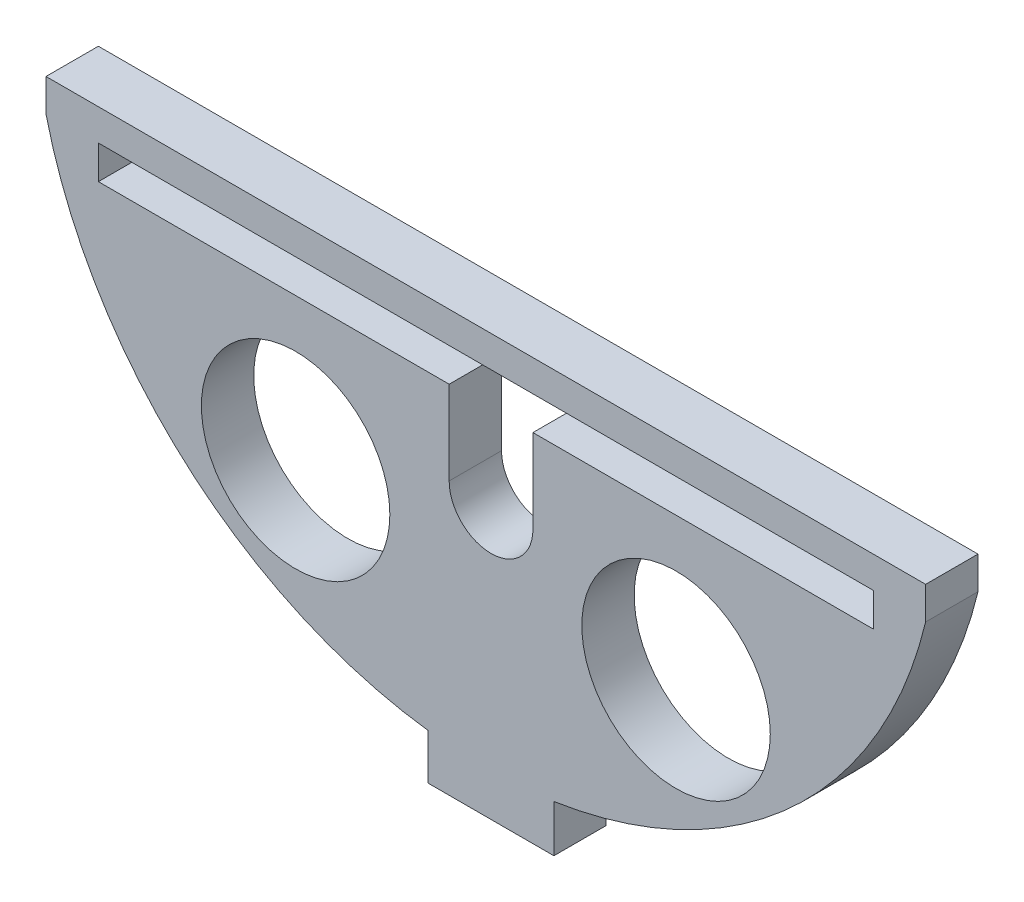
ISO-10303-21;
HEADER;
FILE_DESCRIPTION(('STEP AP214'),'2;1');
FILE_NAME('part.step','',(''),(''),'','','');
FILE_SCHEMA(('AUTOMOTIVE_DESIGN { 1 0 10303 214 1 1 1 1 }'));
ENDSEC;
DATA;
#1=APPLICATION_CONTEXT('core data for automotive mechanical design processes');
#2=APPLICATION_PROTOCOL_DEFINITION('international standard','automotive_design',2000,#1);
#3=PRODUCT_CONTEXT('',#1,'mechanical');
#4=PRODUCT('Part','Part','',(#3));
#5=PRODUCT_RELATED_PRODUCT_CATEGORY('part','',(#4));
#6=PRODUCT_DEFINITION_FORMATION('','',#4);
#7=PRODUCT_DEFINITION_CONTEXT('part definition',#1,'design');
#8=PRODUCT_DEFINITION('design','',#6,#7);
#9=PRODUCT_DEFINITION_SHAPE('','',#8);
#10=(LENGTH_UNIT() NAMED_UNIT(*) SI_UNIT(.MILLI.,.METRE.));
#11=(NAMED_UNIT(*) PLANE_ANGLE_UNIT() SI_UNIT($,.RADIAN.));
#12=(NAMED_UNIT(*) SI_UNIT($,.STERADIAN.) SOLID_ANGLE_UNIT());
#13=UNCERTAINTY_MEASURE_WITH_UNIT(LENGTH_MEASURE(1.E-05),#10,'distance_accuracy_value','');
#14=(GEOMETRIC_REPRESENTATION_CONTEXT(3) GLOBAL_UNCERTAINTY_ASSIGNED_CONTEXT((#13)) GLOBAL_UNIT_ASSIGNED_CONTEXT((#10,
#11,#12)) REPRESENTATION_CONTEXT('',''));
#15=CARTESIAN_POINT('',(0.,0.,0.));
#16=DIRECTION('',(0.,0.,1.));
#17=DIRECTION('',(1.,0.,0.));
#18=AXIS2_PLACEMENT_3D('',#15,#16,#17);
#19=CARTESIAN_POINT('',(-42.,0.,5.));
#20=DIRECTION('',(1.,0.,0.));
#21=DIRECTION('',(0.,0.,-1.));
#22=AXIS2_PLACEMENT_3D('',#19,#20,#21);
#23=PLANE('',#22);
#24=DIRECTION('',(0.,-1.,0.));
#25=VECTOR('',#24,1.);
#26=CARTESIAN_POINT('',(-42.,0.,0.));
#27=LINE('',#26,#25);
#28=CARTESIAN_POINT('',(-42.,4.6,0.));
#29=VERTEX_POINT('',#28);
#30=CARTESIAN_POINT('',(-42.,1.48862027218817,0.));
#31=VERTEX_POINT('',#30);
#32=EDGE_CURVE('E187',#29,#31,#27,.T.);
#33=ORIENTED_EDGE('',*,*,#32,.T.);
#34=DIRECTION('',(0.,0.,-1.));
#35=VECTOR('',#34,1.);
#36=CARTESIAN_POINT('',(-42.,1.48862027218817,5.));
#37=LINE('',#36,#35);
#38=CARTESIAN_POINT('',(-42.,1.48862027218817,5.));
#39=VERTEX_POINT('',#38);
#40=EDGE_CURVE('E11',#39,#31,#37,.T.);
#41=ORIENTED_EDGE('',*,*,#40,.F.);
#42=DIRECTION('',(0.,-1.,0.));
#43=VECTOR('',#42,1.);
#44=CARTESIAN_POINT('',(-42.,0.,5.));
#45=LINE('',#44,#43);
#46=CARTESIAN_POINT('',(-42.,4.6,5.));
#47=VERTEX_POINT('',#46);
#48=EDGE_CURVE('E262',#47,#39,#45,.T.);
#49=ORIENTED_EDGE('',*,*,#48,.F.);
#50=DIRECTION('',(0.,0.,-1.));
#51=VECTOR('',#50,1.);
#52=CARTESIAN_POINT('',(-42.,4.6,5.));
#53=LINE('',#52,#51);
#54=EDGE_CURVE('E53',#47,#29,#53,.T.);
#55=ORIENTED_EDGE('',*,*,#54,.T.);
#56=EDGE_LOOP('',(#33,#41,#49,#55));
#57=FACE_BOUND('',#56,.T.);
#58=ADVANCED_FACE('F34',(#57),#23,.F.);
#59=CARTESIAN_POINT('',(0.,11.6,5.));
#60=DIRECTION('',(0.,0.,-1.));
#61=DIRECTION('',(-1.,0.,0.));
#62=AXIS2_PLACEMENT_3D('',#59,#60,#61);
#63=CYLINDRICAL_SURFACE('',#62,43.2);
#64=CARTESIAN_POINT('',(0.,11.6,0.));
#65=DIRECTION('',(0.,0.,1.));
#66=DIRECTION('',(1.,0.,0.));
#67=AXIS2_PLACEMENT_3D('',#64,#65,#66);
#68=CIRCLE('',#67,43.2);
#69=CARTESIAN_POINT('',(-5.49999999999997,-31.2484538810912,0.));
#70=VERTEX_POINT('',#69);
#71=EDGE_CURVE('E189',#31,#70,#68,.T.);
#72=ORIENTED_EDGE('',*,*,#71,.T.);
#73=DIRECTION('',(0.,0.,-1.));
#74=VECTOR('',#73,1.);
#75=CARTESIAN_POINT('',(-5.49999999999997,-31.2484538810912,90.8848065725249));
#76=LINE('',#75,#74);
#77=CARTESIAN_POINT('',(-5.49999999999997,-31.2484538810912,5.));
#78=VERTEX_POINT('',#77);
#79=EDGE_CURVE('E284',#78,#70,#76,.T.);
#80=ORIENTED_EDGE('',*,*,#79,.F.);
#81=CARTESIAN_POINT('',(0.,11.6,5.));
#82=DIRECTION('',(0.,0.,1.));
#83=DIRECTION('',(1.,0.,0.));
#84=AXIS2_PLACEMENT_3D('',#81,#82,#83);
#85=CIRCLE('',#84,43.2);
#86=EDGE_CURVE('E149',#39,#78,#85,.T.);
#87=ORIENTED_EDGE('',*,*,#86,.F.);
#88=ORIENTED_EDGE('',*,*,#40,.T.);
#89=EDGE_LOOP('',(#72,#80,#87,#88));
#90=FACE_BOUND('',#89,.T.);
#91=ADVANCED_FACE('F290',(#90),#63,.T.);
#92=CARTESIAN_POINT('',(6.50000000000004,-31.1081959347383,0.));
#93=VERTEX_POINT('',#92);
#94=CARTESIAN_POINT('',(42.,1.48862027218852,0.));
#95=VERTEX_POINT('',#94);
#96=EDGE_CURVE('E154',#93,#95,#68,.T.);
#97=ORIENTED_EDGE('',*,*,#96,.T.);
#98=DIRECTION('',(0.,0.,-1.));
#99=VECTOR('',#98,1.);
#100=CARTESIAN_POINT('',(42.,1.48862027218852,5.));
#101=LINE('',#100,#99);
#102=CARTESIAN_POINT('',(42.,1.48862027218852,5.));
#103=VERTEX_POINT('',#102);
#104=EDGE_CURVE('E44',#103,#95,#101,.T.);
#105=ORIENTED_EDGE('',*,*,#104,.F.);
#106=CARTESIAN_POINT('',(6.50000000000004,-31.1081959347383,5.));
#107=VERTEX_POINT('',#106);
#108=EDGE_CURVE('E135',#107,#103,#85,.T.);
#109=ORIENTED_EDGE('',*,*,#108,.F.);
#110=DIRECTION('',(0.,0.,-1.));
#111=VECTOR('',#110,1.);
#112=CARTESIAN_POINT('',(6.50000000000004,-31.1081959347383,90.8848065725249));
#113=LINE('',#112,#111);
#114=EDGE_CURVE('E292',#107,#93,#113,.T.);
#115=ORIENTED_EDGE('',*,*,#114,.T.);
#116=EDGE_LOOP('',(#97,#105,#109,#115));
#117=FACE_BOUND('',#116,.T.);
#118=ADVANCED_FACE('F152',(#117),#63,.T.);
#119=CARTESIAN_POINT('',(42.,0.,5.));
#120=DIRECTION('',(1.,0.,0.));
#121=DIRECTION('',(0.,0.,-1.));
#122=AXIS2_PLACEMENT_3D('',#119,#120,#121);
#123=PLANE('',#122);
#124=DIRECTION('',(0.,-1.,0.));
#125=VECTOR('',#124,1.);
#126=CARTESIAN_POINT('',(42.,0.,0.));
#127=LINE('',#126,#125);
#128=CARTESIAN_POINT('',(42.,4.6,0.));
#129=VERTEX_POINT('',#128);
#130=EDGE_CURVE('E192',#129,#95,#127,.T.);
#131=ORIENTED_EDGE('',*,*,#130,.F.);
#132=DIRECTION('',(0.,0.,-1.));
#133=VECTOR('',#132,1.);
#134=CARTESIAN_POINT('',(42.,4.6,5.));
#135=LINE('',#134,#133);
#136=CARTESIAN_POINT('',(42.,4.6,5.));
#137=VERTEX_POINT('',#136);
#138=EDGE_CURVE('E92',#137,#129,#135,.T.);
#139=ORIENTED_EDGE('',*,*,#138,.F.);
#140=DIRECTION('',(0.,-1.,0.));
#141=VECTOR('',#140,1.);
#142=CARTESIAN_POINT('',(42.,0.,5.));
#143=LINE('',#142,#141);
#144=EDGE_CURVE('E141',#137,#103,#143,.T.);
#145=ORIENTED_EDGE('',*,*,#144,.T.);
#146=ORIENTED_EDGE('',*,*,#104,.T.);
#147=EDGE_LOOP('',(#131,#139,#145,#146));
#148=FACE_BOUND('',#147,.T.);
#149=ADVANCED_FACE('F158',(#148),#123,.T.);
#150=CARTESIAN_POINT('',(0.500000000000032,-9.59999999999999,5.));
#151=DIRECTION('',(0.,0.,-1.));
#152=DIRECTION('',(-1.,0.,0.));
#153=AXIS2_PLACEMENT_3D('',#150,#151,#152);
#154=CYLINDRICAL_SURFACE('',#153,4.);
#155=CARTESIAN_POINT('',(0.500000000000032,-9.59999999999999,0.));
#156=DIRECTION('',(0.,0.,1.));
#157=DIRECTION('',(1.,0.,0.));
#158=AXIS2_PLACEMENT_3D('',#155,#156,#157);
#159=CIRCLE('',#158,4.);
#160=CARTESIAN_POINT('',(-3.49999999999997,-9.59999999999999,0.));
#161=VERTEX_POINT('',#160);
#162=CARTESIAN_POINT('',(4.50000000000003,-9.59999999999999,0.));
#163=VERTEX_POINT('',#162);
#164=EDGE_CURVE('E165',#161,#163,#159,.T.);
#165=ORIENTED_EDGE('',*,*,#164,.F.);
#166=DIRECTION('',(0.,0.,-1.));
#167=VECTOR('',#166,1.);
#168=CARTESIAN_POINT('',(-3.49999999999997,-9.59999999999999,5.));
#169=LINE('',#168,#167);
#170=CARTESIAN_POINT('',(-3.49999999999997,-9.59999999999999,5.));
#171=VERTEX_POINT('',#170);
#172=EDGE_CURVE('E38',#171,#161,#169,.T.);
#173=ORIENTED_EDGE('',*,*,#172,.F.);
#174=CARTESIAN_POINT('',(0.500000000000032,-9.59999999999999,5.));
#175=DIRECTION('',(0.,0.,1.));
#176=DIRECTION('',(1.,0.,0.));
#177=AXIS2_PLACEMENT_3D('',#174,#175,#176);
#178=CIRCLE('',#177,4.);
#179=CARTESIAN_POINT('',(4.50000000000003,-9.59999999999999,5.));
#180=VERTEX_POINT('',#179);
#181=EDGE_CURVE('E197',#171,#180,#178,.T.);
#182=ORIENTED_EDGE('',*,*,#181,.T.);
#183=DIRECTION('',(0.,0.,-1.));
#184=VECTOR('',#183,1.);
#185=CARTESIAN_POINT('',(4.50000000000003,-9.59999999999999,5.));
#186=LINE('',#185,#184);
#187=EDGE_CURVE('E161',#180,#163,#186,.T.);
#188=ORIENTED_EDGE('',*,*,#187,.T.);
#189=EDGE_LOOP('',(#165,#173,#182,#188));
#190=FACE_BOUND('',#189,.T.);
#191=ADVANCED_FACE('F36',(#190),#154,.F.);
#192=CARTESIAN_POINT('',(-3.49999999999997,0.,5.));
#193=DIRECTION('',(-1.,0.,0.));
#194=DIRECTION('',(0.,0.,1.));
#195=AXIS2_PLACEMENT_3D('',#192,#193,#194);
#196=PLANE('',#195);
#197=DIRECTION('',(0.,1.,0.));
#198=VECTOR('',#197,1.);
#199=CARTESIAN_POINT('',(-3.49999999999997,0.,0.));
#200=LINE('',#199,#198);
#201=CARTESIAN_POINT('',(-3.49999999999997,-1.6,0.));
#202=VERTEX_POINT('',#201);
#203=EDGE_CURVE('E168',#161,#202,#200,.T.);
#204=ORIENTED_EDGE('',*,*,#203,.T.);
#205=DIRECTION('',(0.,0.,-1.));
#206=VECTOR('',#205,1.);
#207=CARTESIAN_POINT('',(-3.49999999999997,-1.6,5.));
#208=LINE('',#207,#206);
#209=CARTESIAN_POINT('',(-3.49999999999997,-1.6,5.));
#210=VERTEX_POINT('',#209);
#211=EDGE_CURVE('E211',#210,#202,#208,.T.);
#212=ORIENTED_EDGE('',*,*,#211,.F.);
#213=DIRECTION('',(0.,1.,0.));
#214=VECTOR('',#213,1.);
#215=CARTESIAN_POINT('',(-3.49999999999997,0.,5.));
#216=LINE('',#215,#214);
#217=EDGE_CURVE('E219',#171,#210,#216,.T.);
#218=ORIENTED_EDGE('',*,*,#217,.F.);
#219=ORIENTED_EDGE('',*,*,#172,.T.);
#220=EDGE_LOOP('',(#204,#212,#218,#219));
#221=FACE_BOUND('',#220,.T.);
#222=ADVANCED_FACE('F218',(#221),#196,.F.);
#223=CARTESIAN_POINT('',(0.,-1.6,5.));
#224=DIRECTION('',(0.,1.,0.));
#225=DIRECTION('',(0.,0.,1.));
#226=AXIS2_PLACEMENT_3D('',#223,#224,#225);
#227=PLANE('',#226);
#228=DIRECTION('',(1.,0.,0.));
#229=VECTOR('',#228,1.);
#230=CARTESIAN_POINT('',(0.,-1.6,0.));
#231=LINE('',#230,#229);
#232=CARTESIAN_POINT('',(-37.,-1.6,0.));
#233=VERTEX_POINT('',#232);
#234=EDGE_CURVE('E172',#233,#202,#231,.T.);
#235=ORIENTED_EDGE('',*,*,#234,.F.);
#236=DIRECTION('',(0.,0.,-1.));
#237=VECTOR('',#236,1.);
#238=CARTESIAN_POINT('',(-37.,-1.6,5.));
#239=LINE('',#238,#237);
#240=CARTESIAN_POINT('',(-37.,-1.6,5.));
#241=VERTEX_POINT('',#240);
#242=EDGE_CURVE('E210',#241,#233,#239,.T.);
#243=ORIENTED_EDGE('',*,*,#242,.F.);
#244=DIRECTION('',(1.,0.,0.));
#245=VECTOR('',#244,1.);
#246=CARTESIAN_POINT('',(0.,-1.6,5.));
#247=LINE('',#246,#245);
#248=EDGE_CURVE('E254',#241,#210,#247,.T.);
#249=ORIENTED_EDGE('',*,*,#248,.T.);
#250=ORIENTED_EDGE('',*,*,#211,.T.);
#251=EDGE_LOOP('',(#235,#243,#249,#250));
#252=FACE_BOUND('',#251,.T.);
#253=ADVANCED_FACE('F251',(#252),#227,.T.);
#254=CARTESIAN_POINT('',(-37.,0.,5.));
#255=DIRECTION('',(-1.,0.,0.));
#256=DIRECTION('',(0.,0.,1.));
#257=AXIS2_PLACEMENT_3D('',#254,#255,#256);
#258=PLANE('',#257);
#259=DIRECTION('',(0.,1.,0.));
#260=VECTOR('',#259,1.);
#261=CARTESIAN_POINT('',(-37.,0.,0.));
#262=LINE('',#261,#260);
#263=CARTESIAN_POINT('',(-37.,1.6,0.));
#264=VERTEX_POINT('',#263);
#265=EDGE_CURVE('E175',#233,#264,#262,.T.);
#266=ORIENTED_EDGE('',*,*,#265,.T.);
#267=DIRECTION('',(0.,0.,-1.));
#268=VECTOR('',#267,1.);
#269=CARTESIAN_POINT('',(-37.,1.6,5.));
#270=LINE('',#269,#268);
#271=CARTESIAN_POINT('',(-37.,1.6,5.));
#272=VERTEX_POINT('',#271);
#273=EDGE_CURVE('E207',#272,#264,#270,.T.);
#274=ORIENTED_EDGE('',*,*,#273,.F.);
#275=DIRECTION('',(0.,1.,0.));
#276=VECTOR('',#275,1.);
#277=CARTESIAN_POINT('',(-37.,0.,5.));
#278=LINE('',#277,#276);
#279=EDGE_CURVE('E255',#241,#272,#278,.T.);
#280=ORIENTED_EDGE('',*,*,#279,.F.);
#281=ORIENTED_EDGE('',*,*,#242,.T.);
#282=EDGE_LOOP('',(#266,#274,#280,#281));
#283=FACE_BOUND('',#282,.T.);
#284=ADVANCED_FACE('F256',(#283),#258,.F.);
#285=CARTESIAN_POINT('',(0.,1.6,5.));
#286=DIRECTION('',(0.,1.,0.));
#287=DIRECTION('',(0.,0.,1.));
#288=AXIS2_PLACEMENT_3D('',#285,#286,#287);
#289=PLANE('',#288);
#290=DIRECTION('',(1.,0.,0.));
#291=VECTOR('',#290,1.);
#292=CARTESIAN_POINT('',(0.,1.6,0.));
#293=LINE('',#292,#291);
#294=CARTESIAN_POINT('',(37.,1.6,0.));
#295=VERTEX_POINT('',#294);
#296=EDGE_CURVE('E178',#264,#295,#293,.T.);
#297=ORIENTED_EDGE('',*,*,#296,.T.);
#298=DIRECTION('',(0.,0.,-1.));
#299=VECTOR('',#298,1.);
#300=CARTESIAN_POINT('',(37.,1.6,5.));
#301=LINE('',#300,#299);
#302=CARTESIAN_POINT('',(37.,1.6,5.));
#303=VERTEX_POINT('',#302);
#304=EDGE_CURVE('E205',#303,#295,#301,.T.);
#305=ORIENTED_EDGE('',*,*,#304,.F.);
#306=DIRECTION('',(1.,0.,0.));
#307=VECTOR('',#306,1.);
#308=CARTESIAN_POINT('',(0.,1.6,5.));
#309=LINE('',#308,#307);
#310=EDGE_CURVE('E257',#272,#303,#309,.T.);
#311=ORIENTED_EDGE('',*,*,#310,.F.);
#312=ORIENTED_EDGE('',*,*,#273,.T.);
#313=EDGE_LOOP('',(#297,#305,#311,#312));
#314=FACE_BOUND('',#313,.T.);
#315=ADVANCED_FACE('F248',(#314),#289,.F.);
#316=CARTESIAN_POINT('',(37.,0.,5.));
#317=DIRECTION('',(-1.,0.,0.));
#318=DIRECTION('',(0.,0.,1.));
#319=AXIS2_PLACEMENT_3D('',#316,#317,#318);
#320=PLANE('',#319);
#321=DIRECTION('',(0.,1.,0.));
#322=VECTOR('',#321,1.);
#323=CARTESIAN_POINT('',(37.,0.,0.));
#324=LINE('',#323,#322);
#325=CARTESIAN_POINT('',(37.,-1.6,0.));
#326=VERTEX_POINT('',#325);
#327=EDGE_CURVE('E181',#326,#295,#324,.T.);
#328=ORIENTED_EDGE('',*,*,#327,.F.);
#329=DIRECTION('',(0.,0.,-1.));
#330=VECTOR('',#329,1.);
#331=CARTESIAN_POINT('',(37.,-1.6,5.));
#332=LINE('',#331,#330);
#333=CARTESIAN_POINT('',(37.,-1.6,5.));
#334=VERTEX_POINT('',#333);
#335=EDGE_CURVE('E203',#334,#326,#332,.T.);
#336=ORIENTED_EDGE('',*,*,#335,.F.);
#337=DIRECTION('',(0.,1.,0.));
#338=VECTOR('',#337,1.);
#339=CARTESIAN_POINT('',(37.,0.,5.));
#340=LINE('',#339,#338);
#341=EDGE_CURVE('E245',#334,#303,#340,.T.);
#342=ORIENTED_EDGE('',*,*,#341,.T.);
#343=ORIENTED_EDGE('',*,*,#304,.T.);
#344=EDGE_LOOP('',(#328,#336,#342,#343));
#345=FACE_BOUND('',#344,.T.);
#346=ADVANCED_FACE('F243',(#345),#320,.T.);
#347=CARTESIAN_POINT('',(4.50000000000003,-1.6,0.));
#348=VERTEX_POINT('',#347);
#349=EDGE_CURVE('E176',#348,#326,#231,.T.);
#350=ORIENTED_EDGE('',*,*,#349,.F.);
#351=DIRECTION('',(0.,0.,-1.));
#352=VECTOR('',#351,1.);
#353=CARTESIAN_POINT('',(4.50000000000003,-1.6,5.));
#354=LINE('',#353,#352);
#355=CARTESIAN_POINT('',(4.50000000000003,-1.6,5.));
#356=VERTEX_POINT('',#355);
#357=EDGE_CURVE('E201',#356,#348,#354,.T.);
#358=ORIENTED_EDGE('',*,*,#357,.F.);
#359=EDGE_CURVE('E239',#356,#334,#247,.T.);
#360=ORIENTED_EDGE('',*,*,#359,.T.);
#361=ORIENTED_EDGE('',*,*,#335,.T.);
#362=EDGE_LOOP('',(#350,#358,#360,#361));
#363=FACE_BOUND('',#362,.T.);
#364=ADVANCED_FACE('F236',(#363),#227,.T.);
#365=CARTESIAN_POINT('',(4.50000000000003,0.,5.));
#366=DIRECTION('',(-1.,0.,0.));
#367=DIRECTION('',(0.,0.,1.));
#368=AXIS2_PLACEMENT_3D('',#365,#366,#367);
#369=PLANE('',#368);
#370=DIRECTION('',(0.,1.,0.));
#371=VECTOR('',#370,1.);
#372=CARTESIAN_POINT('',(4.50000000000003,0.,0.));
#373=LINE('',#372,#371);
#374=EDGE_CURVE('E184',#163,#348,#373,.T.);
#375=ORIENTED_EDGE('',*,*,#374,.F.);
#376=ORIENTED_EDGE('',*,*,#187,.F.);
#377=DIRECTION('',(0.,1.,0.));
#378=VECTOR('',#377,1.);
#379=CARTESIAN_POINT('',(4.50000000000003,0.,5.));
#380=LINE('',#379,#378);
#381=EDGE_CURVE('E230',#180,#356,#380,.T.);
#382=ORIENTED_EDGE('',*,*,#381,.T.);
#383=ORIENTED_EDGE('',*,*,#357,.T.);
#384=EDGE_LOOP('',(#375,#376,#382,#383));
#385=FACE_BOUND('',#384,.T.);
#386=ADVANCED_FACE('F229',(#385),#369,.T.);
#387=CARTESIAN_POINT('',(0.,4.6,5.));
#388=DIRECTION('',(0.,1.,0.));
#389=DIRECTION('',(0.,0.,1.));
#390=AXIS2_PLACEMENT_3D('',#387,#388,#389);
#391=PLANE('',#390);
#392=DIRECTION('',(1.,0.,0.));
#393=VECTOR('',#392,1.);
#394=CARTESIAN_POINT('',(0.,4.6,0.));
#395=LINE('',#394,#393);
#396=EDGE_CURVE('E194',#29,#129,#395,.T.);
#397=ORIENTED_EDGE('',*,*,#396,.F.);
#398=ORIENTED_EDGE('',*,*,#54,.F.);
#399=DIRECTION('',(1.,0.,0.));
#400=VECTOR('',#399,1.);
#401=CARTESIAN_POINT('',(0.,4.6,5.));
#402=LINE('',#401,#400);
#403=EDGE_CURVE('E159',#47,#137,#402,.T.);
#404=ORIENTED_EDGE('',*,*,#403,.T.);
#405=ORIENTED_EDGE('',*,*,#138,.T.);
#406=EDGE_LOOP('',(#397,#398,#404,#405));
#407=FACE_BOUND('',#406,.T.);
#408=ADVANCED_FACE('F356',(#407),#391,.T.);
#409=CARTESIAN_POINT('',(0.,0.,5.));
#410=DIRECTION('',(0.,0.,1.));
#411=DIRECTION('',(1.,0.,0.));
#412=AXIS2_PLACEMENT_3D('',#409,#410,#411);
#413=PLANE('',#412);
#414=DIRECTION('',(0.,1.,0.));
#415=VECTOR('',#414,1.);
#416=CARTESIAN_POINT('',(6.49999999999969,0.,5.));
#417=LINE('',#416,#415);
#418=CARTESIAN_POINT('',(6.50000000000008,-35.6000000000003,5.));
#419=VERTEX_POINT('',#418);
#420=EDGE_CURVE('E145',#419,#107,#417,.T.);
#421=ORIENTED_EDGE('',*,*,#420,.T.);
#422=ORIENTED_EDGE('',*,*,#108,.T.);
#423=ORIENTED_EDGE('',*,*,#144,.F.);
#424=ORIENTED_EDGE('',*,*,#403,.F.);
#425=ORIENTED_EDGE('',*,*,#48,.T.);
#426=ORIENTED_EDGE('',*,*,#86,.T.);
#427=DIRECTION('',(0.,-1.,0.));
#428=VECTOR('',#427,1.);
#429=CARTESIAN_POINT('',(-5.49999999999993,0.,5.));
#430=LINE('',#429,#428);
#431=CARTESIAN_POINT('',(-5.49999999999997,-35.6000000000003,5.));
#432=VERTEX_POINT('',#431);
#433=EDGE_CURVE('E273',#78,#432,#430,.T.);
#434=ORIENTED_EDGE('',*,*,#433,.T.);
#435=DIRECTION('',(1.,0.,0.));
#436=VECTOR('',#435,1.);
#437=CARTESIAN_POINT('',(0.,-35.6000000000003,5.));
#438=LINE('',#437,#436);
#439=EDGE_CURVE('E318',#432,#419,#438,.T.);
#440=ORIENTED_EDGE('',*,*,#439,.T.);
#441=EDGE_LOOP('',(#421,#422,#423,#424,#425,#426,#434,#440));
#442=FACE_BOUND('',#441,.T.);
#443=ORIENTED_EDGE('',*,*,#181,.F.);
#444=ORIENTED_EDGE('',*,*,#217,.T.);
#445=ORIENTED_EDGE('',*,*,#248,.F.);
#446=ORIENTED_EDGE('',*,*,#279,.T.);
#447=ORIENTED_EDGE('',*,*,#310,.T.);
#448=ORIENTED_EDGE('',*,*,#341,.F.);
#449=ORIENTED_EDGE('',*,*,#359,.F.);
#450=ORIENTED_EDGE('',*,*,#381,.F.);
#451=EDGE_LOOP('',(#443,#444,#445,#446,#447,#448,#449,#450));
#452=FACE_BOUND('',#451,.T.);
#453=CARTESIAN_POINT('',(-18.1645801446039,-15.2118728003737,5.));
#454=DIRECTION('',(0.,0.,1.));
#455=DIRECTION('',(1.,0.,0.));
#456=AXIS2_PLACEMENT_3D('',#453,#454,#455);
#457=CIRCLE('',#456,9.);
#458=CARTESIAN_POINT('',(-9.16458014460393,-15.2118728003737,5.));
#459=VERTEX_POINT('',#458);
#460=EDGE_CURVE('E294',#459,#459,#457,.T.);
#461=ORIENTED_EDGE('',*,*,#460,.F.);
#462=EDGE_LOOP('',(#461));
#463=FACE_BOUND('',#462,.T.);
#464=CARTESIAN_POINT('',(18.1645801446039,-15.2118728003737,5.));
#465=DIRECTION('',(0.,0.,1.));
#466=DIRECTION('',(1.,0.,0.));
#467=AXIS2_PLACEMENT_3D('',#464,#465,#466);
#468=CIRCLE('',#467,9.);
#469=CARTESIAN_POINT('',(27.1645801446039,-15.2118728003737,5.));
#470=VERTEX_POINT('',#469);
#471=EDGE_CURVE('E169',#470,#470,#468,.F.);
#472=ORIENTED_EDGE('',*,*,#471,.T.);
#473=EDGE_LOOP('',(#472));
#474=FACE_BOUND('',#473,.T.);
#475=ADVANCED_FACE('F137',(#442,#452,#463,#474),#413,.T.);
#476=CARTESIAN_POINT('',(0.,0.,0.));
#477=DIRECTION('',(0.,0.,1.));
#478=DIRECTION('',(1.,0.,0.));
#479=AXIS2_PLACEMENT_3D('',#476,#477,#478);
#480=PLANE('',#479);
#481=ORIENTED_EDGE('',*,*,#96,.F.);
#482=DIRECTION('',(0.,1.,0.));
#483=VECTOR('',#482,1.);
#484=CARTESIAN_POINT('',(6.49999999999969,0.,0.));
#485=LINE('',#484,#483);
#486=CARTESIAN_POINT('',(6.50000000000008,-35.6000000000003,0.));
#487=VERTEX_POINT('',#486);
#488=EDGE_CURVE('E296',#487,#93,#485,.T.);
#489=ORIENTED_EDGE('',*,*,#488,.F.);
#490=DIRECTION('',(1.,0.,0.));
#491=VECTOR('',#490,1.);
#492=CARTESIAN_POINT('',(0.,-35.6000000000003,0.));
#493=LINE('',#492,#491);
#494=CARTESIAN_POINT('',(-5.49999999999997,-35.6000000000003,0.));
#495=VERTEX_POINT('',#494);
#496=EDGE_CURVE('E301',#495,#487,#493,.T.);
#497=ORIENTED_EDGE('',*,*,#496,.F.);
#498=DIRECTION('',(0.,-1.,0.));
#499=VECTOR('',#498,1.);
#500=CARTESIAN_POINT('',(-5.49999999999993,0.,0.));
#501=LINE('',#500,#499);
#502=EDGE_CURVE('E291',#70,#495,#501,.T.);
#503=ORIENTED_EDGE('',*,*,#502,.F.);
#504=ORIENTED_EDGE('',*,*,#71,.F.);
#505=ORIENTED_EDGE('',*,*,#32,.F.);
#506=ORIENTED_EDGE('',*,*,#396,.T.);
#507=ORIENTED_EDGE('',*,*,#130,.T.);
#508=EDGE_LOOP('',(#481,#489,#497,#503,#504,#505,#506,#507));
#509=FACE_BOUND('',#508,.T.);
#510=ORIENTED_EDGE('',*,*,#164,.T.);
#511=ORIENTED_EDGE('',*,*,#374,.T.);
#512=ORIENTED_EDGE('',*,*,#349,.T.);
#513=ORIENTED_EDGE('',*,*,#327,.T.);
#514=ORIENTED_EDGE('',*,*,#296,.F.);
#515=ORIENTED_EDGE('',*,*,#265,.F.);
#516=ORIENTED_EDGE('',*,*,#234,.T.);
#517=ORIENTED_EDGE('',*,*,#203,.F.);
#518=EDGE_LOOP('',(#510,#511,#512,#513,#514,#515,#516,#517));
#519=FACE_BOUND('',#518,.T.);
#520=CARTESIAN_POINT('',(18.1645801446039,-15.2118728003737,0.));
#521=DIRECTION('',(0.,0.,1.));
#522=DIRECTION('',(1.,0.,0.));
#523=AXIS2_PLACEMENT_3D('',#520,#521,#522);
#524=CIRCLE('',#523,9.);
#525=CARTESIAN_POINT('',(27.1645801446039,-15.2118728003737,0.));
#526=VERTEX_POINT('',#525);
#527=EDGE_CURVE('E302',#526,#526,#524,.F.);
#528=ORIENTED_EDGE('',*,*,#527,.F.);
#529=EDGE_LOOP('',(#528));
#530=FACE_BOUND('',#529,.T.);
#531=CARTESIAN_POINT('',(-18.1645801446039,-15.2118728003737,0.));
#532=DIRECTION('',(0.,0.,1.));
#533=DIRECTION('',(1.,0.,0.));
#534=AXIS2_PLACEMENT_3D('',#531,#532,#533);
#535=CIRCLE('',#534,9.);
#536=CARTESIAN_POINT('',(-9.16458014460393,-15.2118728003737,0.));
#537=VERTEX_POINT('',#536);
#538=EDGE_CURVE('E315',#537,#537,#535,.T.);
#539=ORIENTED_EDGE('',*,*,#538,.T.);
#540=EDGE_LOOP('',(#539));
#541=FACE_BOUND('',#540,.T.);
#542=ADVANCED_FACE('F222',(#509,#519,#530,#541),#480,.F.);
#543=CARTESIAN_POINT('',(6.49999999999969,0.,90.8848065725249));
#544=DIRECTION('',(-1.,0.,0.));
#545=DIRECTION('',(0.,-1.,0.));
#546=AXIS2_PLACEMENT_3D('',#543,#544,#545);
#547=PLANE('',#546);
#548=ORIENTED_EDGE('',*,*,#420,.F.);
#549=DIRECTION('',(0.,0.,-1.));
#550=VECTOR('',#549,1.);
#551=CARTESIAN_POINT('',(6.50000000000008,-35.6000000000003,90.8848065725249));
#552=LINE('',#551,#550);
#553=EDGE_CURVE('E303',#419,#487,#552,.T.);
#554=ORIENTED_EDGE('',*,*,#553,.T.);
#555=ORIENTED_EDGE('',*,*,#488,.T.);
#556=ORIENTED_EDGE('',*,*,#114,.F.);
#557=EDGE_LOOP('',(#548,#554,#555,#556));
#558=FACE_BOUND('',#557,.T.);
#559=ADVANCED_FACE('F335',(#558),#547,.F.);
#560=CARTESIAN_POINT('',(-5.49999999999993,0.,90.8848065725249));
#561=DIRECTION('',(1.,0.,0.));
#562=DIRECTION('',(0.,1.,0.));
#563=AXIS2_PLACEMENT_3D('',#560,#561,#562);
#564=PLANE('',#563);
#565=ORIENTED_EDGE('',*,*,#433,.F.);
#566=ORIENTED_EDGE('',*,*,#79,.T.);
#567=ORIENTED_EDGE('',*,*,#502,.T.);
#568=DIRECTION('',(0.,0.,-1.));
#569=VECTOR('',#568,1.);
#570=CARTESIAN_POINT('',(-5.49999999999997,-35.6000000000003,90.8848065725249));
#571=LINE('',#570,#569);
#572=EDGE_CURVE('E287',#432,#495,#571,.T.);
#573=ORIENTED_EDGE('',*,*,#572,.F.);
#574=EDGE_LOOP('',(#565,#566,#567,#573));
#575=FACE_BOUND('',#574,.T.);
#576=ADVANCED_FACE('F282',(#575),#564,.F.);
#577=CARTESIAN_POINT('',(-18.1645801446039,-15.2118728003737,90.8848065725249));
#578=DIRECTION('',(0.,0.,-1.));
#579=DIRECTION('',(-1.,0.,0.));
#580=AXIS2_PLACEMENT_3D('',#577,#578,#579);
#581=CYLINDRICAL_SURFACE('',#580,9.);
#582=ORIENTED_EDGE('',*,*,#538,.F.);
#583=EDGE_LOOP('',(#582));
#584=FACE_BOUND('',#583,.T.);
#585=ORIENTED_EDGE('',*,*,#460,.T.);
#586=EDGE_LOOP('',(#585));
#587=FACE_BOUND('',#586,.T.);
#588=ADVANCED_FACE('F342',(#584,#587),#581,.F.);
#589=CARTESIAN_POINT('',(18.1645801446039,-15.2118728003737,90.8848065725249));
#590=DIRECTION('',(0.,0.,-1.));
#591=DIRECTION('',(-1.,0.,0.));
#592=AXIS2_PLACEMENT_3D('',#589,#590,#591);
#593=CYLINDRICAL_SURFACE('',#592,9.);
#594=ORIENTED_EDGE('',*,*,#527,.T.);
#595=EDGE_LOOP('',(#594));
#596=FACE_BOUND('',#595,.T.);
#597=ORIENTED_EDGE('',*,*,#471,.F.);
#598=EDGE_LOOP('',(#597));
#599=FACE_BOUND('',#598,.T.);
#600=ADVANCED_FACE('F407',(#596,#599),#593,.F.);
#601=CARTESIAN_POINT('',(0.,-35.6000000000003,90.8848065725249));
#602=DIRECTION('',(0.,1.,0.));
#603=DIRECTION('',(0.,0.,1.));
#604=AXIS2_PLACEMENT_3D('',#601,#602,#603);
#605=PLANE('',#604);
#606=ORIENTED_EDGE('',*,*,#439,.F.);
#607=ORIENTED_EDGE('',*,*,#572,.T.);
#608=ORIENTED_EDGE('',*,*,#496,.T.);
#609=ORIENTED_EDGE('',*,*,#553,.F.);
#610=EDGE_LOOP('',(#606,#607,#608,#609));
#611=FACE_BOUND('',#610,.T.);
#612=ADVANCED_FACE('F327',(#611),#605,.F.);
#613=CLOSED_SHELL('',(#58,#91,#118,#149,#191,#222,#253,#284,#315,#346,#364,#386,#408,#475,#542,
#559,#576,#588,#600,#612));
#614=MANIFOLD_SOLID_BREP('B2',#613);
#615=ADVANCED_BREP_SHAPE_REPRESENTATION('',(#18,#614),#14);
#616=SHAPE_DEFINITION_REPRESENTATION(#9,#615);
ENDSEC;
END-ISO-10303-21;
